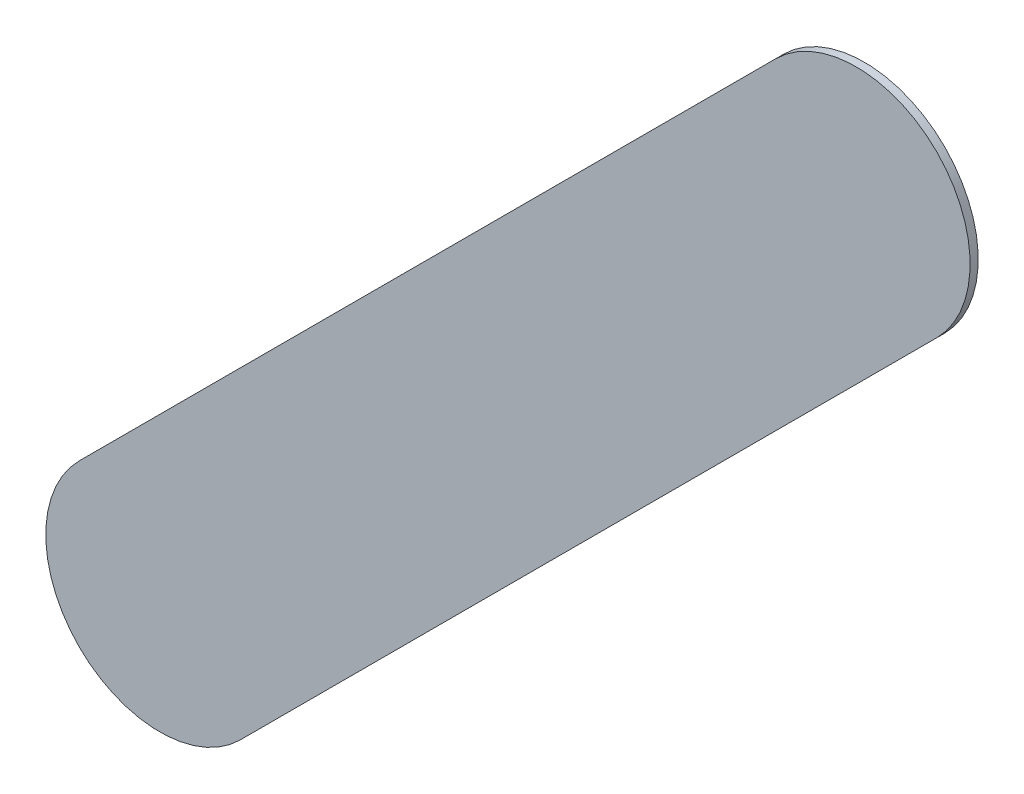
ISO-10303-21;
HEADER;
FILE_DESCRIPTION(('STEP AP214'),'2;1');
FILE_NAME('part.step','',(''),(''),'','','');
FILE_SCHEMA(('AUTOMOTIVE_DESIGN { 1 0 10303 214 1 1 1 1 }'));
ENDSEC;
DATA;
#1=APPLICATION_CONTEXT('core data for automotive mechanical design processes');
#2=APPLICATION_PROTOCOL_DEFINITION('international standard','automotive_design',2000,#1);
#3=PRODUCT_CONTEXT('',#1,'mechanical');
#4=PRODUCT('Part','Part','',(#3));
#5=PRODUCT_RELATED_PRODUCT_CATEGORY('part','',(#4));
#6=PRODUCT_DEFINITION_FORMATION('','',#4);
#7=PRODUCT_DEFINITION_CONTEXT('part definition',#1,'design');
#8=PRODUCT_DEFINITION('design','',#6,#7);
#9=PRODUCT_DEFINITION_SHAPE('','',#8);
#10=(LENGTH_UNIT() NAMED_UNIT(*) SI_UNIT(.MILLI.,.METRE.));
#11=(NAMED_UNIT(*) PLANE_ANGLE_UNIT() SI_UNIT($,.RADIAN.));
#12=(NAMED_UNIT(*) SI_UNIT($,.STERADIAN.) SOLID_ANGLE_UNIT());
#13=UNCERTAINTY_MEASURE_WITH_UNIT(LENGTH_MEASURE(1.E-05),#10,'distance_accuracy_value','');
#14=(GEOMETRIC_REPRESENTATION_CONTEXT(3) GLOBAL_UNCERTAINTY_ASSIGNED_CONTEXT((#13)) GLOBAL_UNIT_ASSIGNED_CONTEXT((#10,
#11,#12)) REPRESENTATION_CONTEXT('',''));
#15=CARTESIAN_POINT('',(0.,0.,0.));
#16=DIRECTION('',(0.,0.,1.));
#17=DIRECTION('',(1.,0.,0.));
#18=AXIS2_PLACEMENT_3D('',#15,#16,#17);
#19=CARTESIAN_POINT('',(110.79275276,49.04944724,0.));
#20=DIRECTION('',(-0.707106781186548,0.707106781186548,0.));
#21=DIRECTION('',(0.707106781186548,0.707106781186548,0.));
#22=AXIS2_PLACEMENT_3D('',#19,#20,#21);
#23=PLANE('',#22);
#24=DIRECTION('',(0.707106781186548,0.707106781186548,0.));
#25=VECTOR('',#24,1.);
#26=CARTESIAN_POINT('',(110.79275276,49.04944724,0.03556));
#27=LINE('',#26,#25);
#28=CARTESIAN_POINT('',(110.79275276,49.04944724,0.03556));
#29=VERTEX_POINT('',#28);
#30=CARTESIAN_POINT('',(113.84974436,52.10643884,0.03556));
#31=VERTEX_POINT('',#30);
#32=EDGE_CURVE('E11',#29,#31,#27,.T.);
#33=ORIENTED_EDGE('',*,*,#32,.F.);
#34=DIRECTION('',(0.,0.,1.));
#35=VECTOR('',#34,1.);
#36=CARTESIAN_POINT('',(110.79275276,49.04944724,0.));
#37=LINE('',#36,#35);
#38=CARTESIAN_POINT('',(110.79275276,49.04944724,0.));
#39=VERTEX_POINT('',#38);
#40=EDGE_CURVE('E24',#39,#29,#37,.T.);
#41=ORIENTED_EDGE('',*,*,#40,.F.);
#42=DIRECTION('',(0.707106781186548,0.707106781186548,0.));
#43=VECTOR('',#42,1.);
#44=CARTESIAN_POINT('',(110.79275276,49.04944724,0.));
#45=LINE('',#44,#43);
#46=CARTESIAN_POINT('',(113.84974436,52.10643884,0.));
#47=VERTEX_POINT('',#46);
#48=EDGE_CURVE('E75',#39,#47,#45,.T.);
#49=ORIENTED_EDGE('',*,*,#48,.T.);
#50=DIRECTION('',(0.,0.,1.));
#51=VECTOR('',#50,1.);
#52=CARTESIAN_POINT('',(113.84974436,52.10643884,0.));
#53=LINE('',#52,#51);
#54=EDGE_CURVE('E37',#47,#31,#53,.T.);
#55=ORIENTED_EDGE('',*,*,#54,.T.);
#56=EDGE_LOOP('',(#33,#41,#49,#55));
#57=FACE_BOUND('',#56,.T.);
#58=ADVANCED_FACE('F17',(#57),#23,.F.);
#59=CARTESIAN_POINT('',(113.4961916,52.4599916,0.));
#60=DIRECTION('',(0.,0.,-1.));
#61=DIRECTION('',(0.707106781186533,-0.707106781186562,0.));
#62=AXIS2_PLACEMENT_3D('',#59,#60,#61);
#63=CYLINDRICAL_SURFACE('',#62,0.499999108206433);
#64=CARTESIAN_POINT('',(113.4961916,52.4599916,0.03556));
#65=DIRECTION('',(0.,0.,1.));
#66=DIRECTION('',(0.707106781186533,-0.707106781186562,0.));
#67=AXIS2_PLACEMENT_3D('',#64,#65,#66);
#68=CIRCLE('',#67,0.499999108206433);
#69=CARTESIAN_POINT('',(113.14263884,52.81354436,0.03556));
#70=VERTEX_POINT('',#69);
#71=EDGE_CURVE('E83',#31,#70,#68,.T.);
#72=ORIENTED_EDGE('',*,*,#71,.F.);
#73=ORIENTED_EDGE('',*,*,#54,.F.);
#74=CARTESIAN_POINT('',(113.4961916,52.4599916,0.));
#75=DIRECTION('',(0.,0.,1.));
#76=DIRECTION('',(0.707106781186533,-0.707106781186562,0.));
#77=AXIS2_PLACEMENT_3D('',#74,#75,#76);
#78=CIRCLE('',#77,0.499999108206433);
#79=CARTESIAN_POINT('',(113.14263884,52.81354436,0.));
#80=VERTEX_POINT('',#79);
#81=EDGE_CURVE('E81',#47,#80,#78,.T.);
#82=ORIENTED_EDGE('',*,*,#81,.T.);
#83=DIRECTION('',(0.,0.,1.));
#84=VECTOR('',#83,1.);
#85=CARTESIAN_POINT('',(113.14263884,52.81354436,0.));
#86=LINE('',#85,#84);
#87=EDGE_CURVE('E67',#80,#70,#86,.T.);
#88=ORIENTED_EDGE('',*,*,#87,.T.);
#89=EDGE_LOOP('',(#72,#73,#82,#88));
#90=FACE_BOUND('',#89,.T.);
#91=ADVANCED_FACE('F89',(#90),#63,.T.);
#92=CARTESIAN_POINT('',(113.14263884,52.81354436,0.));
#93=DIRECTION('',(0.707106781186546,-0.707106781186549,0.));
#94=DIRECTION('',(-0.707106781186549,-0.707106781186546,0.));
#95=AXIS2_PLACEMENT_3D('',#92,#93,#94);
#96=PLANE('',#95);
#97=DIRECTION('',(-0.707106781186549,-0.707106781186546,0.));
#98=VECTOR('',#97,1.);
#99=CARTESIAN_POINT('',(113.14263884,52.81354436,0.03556));
#100=LINE('',#99,#98);
#101=CARTESIAN_POINT('',(110.08564724,49.75655276,0.03556));
#102=VERTEX_POINT('',#101);
#103=EDGE_CURVE('E71',#70,#102,#100,.T.);
#104=ORIENTED_EDGE('',*,*,#103,.F.);
#105=ORIENTED_EDGE('',*,*,#87,.F.);
#106=DIRECTION('',(-0.707106781186549,-0.707106781186546,0.));
#107=VECTOR('',#106,1.);
#108=CARTESIAN_POINT('',(113.14263884,52.81354436,0.));
#109=LINE('',#108,#107);
#110=CARTESIAN_POINT('',(110.08564724,49.75655276,0.));
#111=VERTEX_POINT('',#110);
#112=EDGE_CURVE('E63',#80,#111,#109,.T.);
#113=ORIENTED_EDGE('',*,*,#112,.T.);
#114=DIRECTION('',(0.,0.,1.));
#115=VECTOR('',#114,1.);
#116=CARTESIAN_POINT('',(110.08564724,49.75655276,0.));
#117=LINE('',#116,#115);
#118=EDGE_CURVE('E53',#111,#102,#117,.T.);
#119=ORIENTED_EDGE('',*,*,#118,.T.);
#120=EDGE_LOOP('',(#104,#105,#113,#119));
#121=FACE_BOUND('',#120,.T.);
#122=ADVANCED_FACE('F66',(#121),#96,.F.);
#123=CARTESIAN_POINT('',(110.4392,49.403,0.));
#124=DIRECTION('',(0.,0.,-1.));
#125=DIRECTION('',(-0.707106781186548,0.707106781186548,0.));
#126=AXIS2_PLACEMENT_3D('',#123,#124,#125);
#127=CYLINDRICAL_SURFACE('',#126,0.499999108206439);
#128=CARTESIAN_POINT('',(110.4392,49.403,0.03556));
#129=DIRECTION('',(0.,0.,1.));
#130=DIRECTION('',(-0.707106781186548,0.707106781186548,0.));
#131=AXIS2_PLACEMENT_3D('',#128,#129,#130);
#132=CIRCLE('',#131,0.499999108206439);
#133=EDGE_CURVE('E59',#102,#29,#132,.T.);
#134=ORIENTED_EDGE('',*,*,#133,.F.);
#135=ORIENTED_EDGE('',*,*,#118,.F.);
#136=CARTESIAN_POINT('',(110.4392,49.403,0.));
#137=DIRECTION('',(0.,0.,1.));
#138=DIRECTION('',(-0.707106781186548,0.707106781186548,0.));
#139=AXIS2_PLACEMENT_3D('',#136,#137,#138);
#140=CIRCLE('',#139,0.499999108206439);
#141=EDGE_CURVE('E57',#111,#39,#140,.T.);
#142=ORIENTED_EDGE('',*,*,#141,.T.);
#143=ORIENTED_EDGE('',*,*,#40,.T.);
#144=EDGE_LOOP('',(#134,#135,#142,#143));
#145=FACE_BOUND('',#144,.T.);
#146=ADVANCED_FACE('F55',(#145),#127,.T.);
#147=CARTESIAN_POINT('',(110.79275276,49.04944724,0.));
#148=DIRECTION('',(0.,0.,-1.));
#149=DIRECTION('',(-1.,0.,0.));
#150=AXIS2_PLACEMENT_3D('',#147,#148,#149);
#151=PLANE('',#150);
#152=ORIENTED_EDGE('',*,*,#141,.F.);
#153=ORIENTED_EDGE('',*,*,#112,.F.);
#154=ORIENTED_EDGE('',*,*,#81,.F.);
#155=ORIENTED_EDGE('',*,*,#48,.F.);
#156=EDGE_LOOP('',(#152,#153,#154,#155));
#157=FACE_BOUND('',#156,.T.);
#158=ADVANCED_FACE('F74',(#157),#151,.T.);
#159=CARTESIAN_POINT('',(110.79275276,49.04944724,0.03556));
#160=DIRECTION('',(0.,0.,-1.));
#161=DIRECTION('',(-1.,0.,0.));
#162=AXIS2_PLACEMENT_3D('',#159,#160,#161);
#163=PLANE('',#162);
#164=ORIENTED_EDGE('',*,*,#32,.T.);
#165=ORIENTED_EDGE('',*,*,#71,.T.);
#166=ORIENTED_EDGE('',*,*,#103,.T.);
#167=ORIENTED_EDGE('',*,*,#133,.T.);
#168=EDGE_LOOP('',(#164,#165,#166,#167));
#169=FACE_BOUND('',#168,.T.);
#170=ADVANCED_FACE('F91',(#169),#163,.F.);
#171=CLOSED_SHELL('',(#58,#91,#122,#146,#158,#170));
#172=MANIFOLD_SOLID_BREP('B1',#171);
#173=ADVANCED_BREP_SHAPE_REPRESENTATION('',(#18,#172),#14);
#174=SHAPE_DEFINITION_REPRESENTATION(#9,#173);
ENDSEC;
END-ISO-10303-21;
